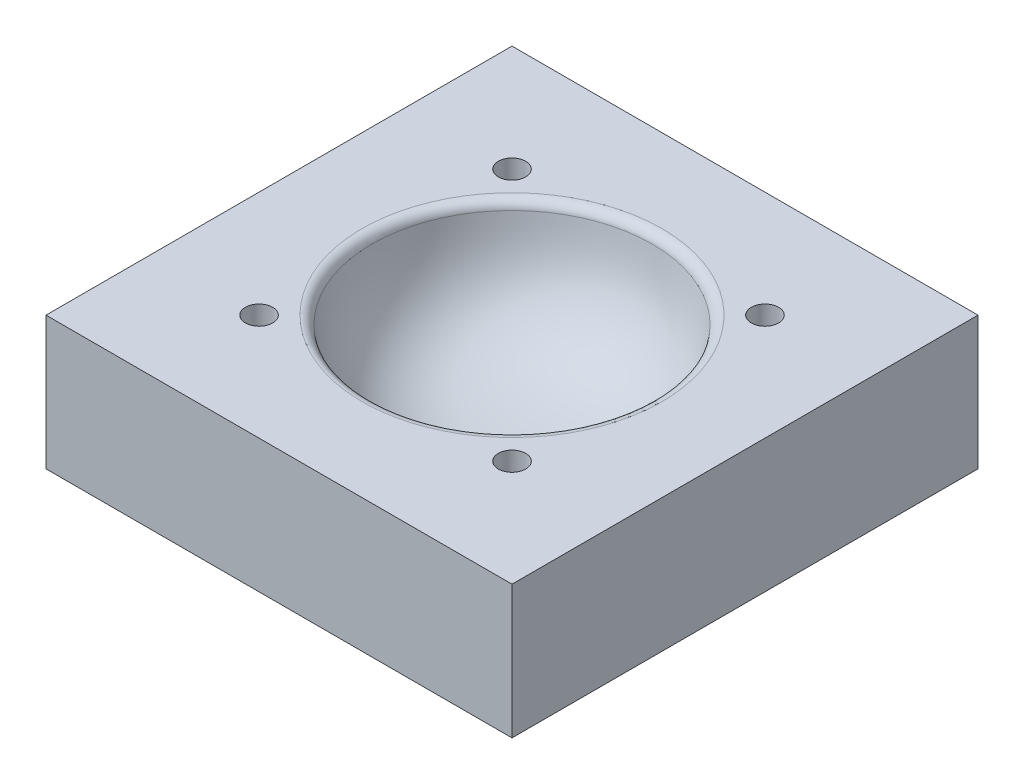
ISO-10303-21;
HEADER;
FILE_DESCRIPTION(('STEP AP214'),'2;1');
FILE_NAME('part.step','',(''),(''),'','','');
FILE_SCHEMA(('AUTOMOTIVE_DESIGN { 1 0 10303 214 1 1 1 1 }'));
ENDSEC;
DATA;
#1=APPLICATION_CONTEXT('core data for automotive mechanical design processes');
#2=APPLICATION_PROTOCOL_DEFINITION('international standard','automotive_design',2000,#1);
#3=PRODUCT_CONTEXT('',#1,'mechanical');
#4=PRODUCT('Part','Part','',(#3));
#5=PRODUCT_RELATED_PRODUCT_CATEGORY('part','',(#4));
#6=PRODUCT_DEFINITION_FORMATION('','',#4);
#7=PRODUCT_DEFINITION_CONTEXT('part definition',#1,'design');
#8=PRODUCT_DEFINITION('design','',#6,#7);
#9=PRODUCT_DEFINITION_SHAPE('','',#8);
#10=(LENGTH_UNIT() NAMED_UNIT(*) SI_UNIT(.MILLI.,.METRE.));
#11=(NAMED_UNIT(*) PLANE_ANGLE_UNIT() SI_UNIT($,.RADIAN.));
#12=(NAMED_UNIT(*) SI_UNIT($,.STERADIAN.) SOLID_ANGLE_UNIT());
#13=UNCERTAINTY_MEASURE_WITH_UNIT(LENGTH_MEASURE(1.E-05),#10,'distance_accuracy_value','');
#14=(GEOMETRIC_REPRESENTATION_CONTEXT(3) GLOBAL_UNCERTAINTY_ASSIGNED_CONTEXT((#13)) GLOBAL_UNIT_ASSIGNED_CONTEXT((#10,
#11,#12)) REPRESENTATION_CONTEXT('',''));
#15=CARTESIAN_POINT('',(0.,0.,0.));
#16=DIRECTION('',(0.,0.,1.));
#17=DIRECTION('',(1.,0.,0.));
#18=AXIS2_PLACEMENT_3D('',#15,#16,#17);
#19=CARTESIAN_POINT('',(35.,-20.,35.));
#20=DIRECTION('',(1.,0.,0.));
#21=DIRECTION('',(0.,0.,-1.));
#22=AXIS2_PLACEMENT_3D('',#19,#20,#21);
#23=PLANE('',#22);
#24=DIRECTION('',(0.,0.,-1.));
#25=VECTOR('',#24,1.);
#26=CARTESIAN_POINT('',(35.,0.,35.));
#27=LINE('',#26,#25);
#28=CARTESIAN_POINT('',(35.,0.,35.));
#29=VERTEX_POINT('',#28);
#30=CARTESIAN_POINT('',(35.,0.,-35.));
#31=VERTEX_POINT('',#30);
#32=EDGE_CURVE('E150',#29,#31,#27,.T.);
#33=ORIENTED_EDGE('',*,*,#32,.F.);
#34=DIRECTION('',(0.,1.,0.));
#35=VECTOR('',#34,1.);
#36=CARTESIAN_POINT('',(35.,-20.,35.));
#37=LINE('',#36,#35);
#38=CARTESIAN_POINT('',(35.,-20.,35.));
#39=VERTEX_POINT('',#38);
#40=EDGE_CURVE('E50',#39,#29,#37,.T.);
#41=ORIENTED_EDGE('',*,*,#40,.F.);
#42=DIRECTION('',(0.,0.,-1.));
#43=VECTOR('',#42,1.);
#44=CARTESIAN_POINT('',(35.,-20.,35.));
#45=LINE('',#44,#43);
#46=CARTESIAN_POINT('',(35.,-20.,-35.));
#47=VERTEX_POINT('',#46);
#48=EDGE_CURVE('E137',#39,#47,#45,.T.);
#49=ORIENTED_EDGE('',*,*,#48,.T.);
#50=DIRECTION('',(0.,1.,0.));
#51=VECTOR('',#50,1.);
#52=CARTESIAN_POINT('',(35.,-20.,-35.));
#53=LINE('',#52,#51);
#54=EDGE_CURVE('E79',#47,#31,#53,.T.);
#55=ORIENTED_EDGE('',*,*,#54,.T.);
#56=EDGE_LOOP('',(#33,#41,#49,#55));
#57=FACE_BOUND('',#56,.T.);
#58=ADVANCED_FACE('F33',(#57),#23,.T.);
#59=CARTESIAN_POINT('',(-35.,-20.,35.));
#60=DIRECTION('',(0.,0.,1.));
#61=DIRECTION('',(1.,0.,0.));
#62=AXIS2_PLACEMENT_3D('',#59,#60,#61);
#63=PLANE('',#62);
#64=DIRECTION('',(1.,0.,0.));
#65=VECTOR('',#64,1.);
#66=CARTESIAN_POINT('',(-35.,0.,35.));
#67=LINE('',#66,#65);
#68=CARTESIAN_POINT('',(-35.,0.,35.));
#69=VERTEX_POINT('',#68);
#70=EDGE_CURVE('E141',#69,#29,#67,.T.);
#71=ORIENTED_EDGE('',*,*,#70,.F.);
#72=DIRECTION('',(0.,1.,0.));
#73=VECTOR('',#72,1.);
#74=CARTESIAN_POINT('',(-35.,-20.,35.));
#75=LINE('',#74,#73);
#76=CARTESIAN_POINT('',(-35.,-20.,35.));
#77=VERTEX_POINT('',#76);
#78=EDGE_CURVE('E68',#77,#69,#75,.T.);
#79=ORIENTED_EDGE('',*,*,#78,.F.);
#80=DIRECTION('',(1.,0.,0.));
#81=VECTOR('',#80,1.);
#82=CARTESIAN_POINT('',(-35.,-20.,35.));
#83=LINE('',#82,#81);
#84=EDGE_CURVE('E139',#77,#39,#83,.T.);
#85=ORIENTED_EDGE('',*,*,#84,.T.);
#86=ORIENTED_EDGE('',*,*,#40,.T.);
#87=EDGE_LOOP('',(#71,#79,#85,#86));
#88=FACE_BOUND('',#87,.T.);
#89=ADVANCED_FACE('F104',(#88),#63,.T.);
#90=CARTESIAN_POINT('',(-35.,-20.,35.));
#91=DIRECTION('',(-1.,0.,0.));
#92=DIRECTION('',(0.,0.,1.));
#93=AXIS2_PLACEMENT_3D('',#90,#91,#92);
#94=PLANE('',#93);
#95=DIRECTION('',(0.,0.,1.));
#96=VECTOR('',#95,1.);
#97=CARTESIAN_POINT('',(-35.,0.,35.));
#98=LINE('',#97,#96);
#99=CARTESIAN_POINT('',(-35.,0.,-35.));
#100=VERTEX_POINT('',#99);
#101=EDGE_CURVE('E156',#100,#69,#98,.T.);
#102=ORIENTED_EDGE('',*,*,#101,.F.);
#103=DIRECTION('',(0.,1.,0.));
#104=VECTOR('',#103,1.);
#105=CARTESIAN_POINT('',(-35.,-20.,-35.));
#106=LINE('',#105,#104);
#107=CARTESIAN_POINT('',(-35.,-20.,-35.));
#108=VERTEX_POINT('',#107);
#109=EDGE_CURVE('E145',#108,#100,#106,.T.);
#110=ORIENTED_EDGE('',*,*,#109,.F.);
#111=DIRECTION('',(0.,0.,1.));
#112=VECTOR('',#111,1.);
#113=CARTESIAN_POINT('',(-35.,-20.,35.));
#114=LINE('',#113,#112);
#115=EDGE_CURVE('E143',#108,#77,#114,.T.);
#116=ORIENTED_EDGE('',*,*,#115,.T.);
#117=ORIENTED_EDGE('',*,*,#78,.T.);
#118=EDGE_LOOP('',(#102,#110,#116,#117));
#119=FACE_BOUND('',#118,.T.);
#120=ADVANCED_FACE('F108',(#119),#94,.T.);
#121=CARTESIAN_POINT('',(-35.,-20.,-35.));
#122=DIRECTION('',(0.,0.,-1.));
#123=DIRECTION('',(-1.,0.,0.));
#124=AXIS2_PLACEMENT_3D('',#121,#122,#123);
#125=PLANE('',#124);
#126=DIRECTION('',(-1.,0.,0.));
#127=VECTOR('',#126,1.);
#128=CARTESIAN_POINT('',(-35.,0.,-35.));
#129=LINE('',#128,#127);
#130=EDGE_CURVE('E153',#31,#100,#129,.T.);
#131=ORIENTED_EDGE('',*,*,#130,.F.);
#132=ORIENTED_EDGE('',*,*,#54,.F.);
#133=DIRECTION('',(-1.,0.,0.));
#134=VECTOR('',#133,1.);
#135=CARTESIAN_POINT('',(-35.,-20.,-35.));
#136=LINE('',#135,#134);
#137=EDGE_CURVE('E140',#47,#108,#136,.T.);
#138=ORIENTED_EDGE('',*,*,#137,.T.);
#139=ORIENTED_EDGE('',*,*,#109,.T.);
#140=EDGE_LOOP('',(#131,#132,#138,#139));
#141=FACE_BOUND('',#140,.T.);
#142=ADVANCED_FACE('F111',(#141),#125,.T.);
#143=CARTESIAN_POINT('',(0.,-20.,0.));
#144=DIRECTION('',(0.,-1.,0.));
#145=DIRECTION('',(0.,0.,-1.));
#146=AXIS2_PLACEMENT_3D('',#143,#144,#145);
#147=PLANE('',#146);
#148=CARTESIAN_POINT('',(19.,-20.,-19.));
#149=DIRECTION('',(0.,1.,0.));
#150=DIRECTION('',(0.,0.,1.));
#151=AXIS2_PLACEMENT_3D('',#148,#149,#150);
#152=CIRCLE('',#151,2.05000000000001);
#153=CARTESIAN_POINT('',(19.,-20.,-16.95));
#154=VERTEX_POINT('',#153);
#155=EDGE_CURVE('E123',#154,#154,#152,.T.);
#156=ORIENTED_EDGE('',*,*,#155,.T.);
#157=EDGE_LOOP('',(#156));
#158=FACE_BOUND('',#157,.T.);
#159=CARTESIAN_POINT('',(-19.,-20.,19.));
#160=DIRECTION('',(0.,1.,0.));
#161=DIRECTION('',(0.,0.,-1.));
#162=AXIS2_PLACEMENT_3D('',#159,#160,#161);
#163=CIRCLE('',#162,2.05);
#164=CARTESIAN_POINT('',(-19.,-20.,16.95));
#165=VERTEX_POINT('',#164);
#166=EDGE_CURVE('E127',#165,#165,#163,.T.);
#167=ORIENTED_EDGE('',*,*,#166,.T.);
#168=EDGE_LOOP('',(#167));
#169=FACE_BOUND('',#168,.T.);
#170=CARTESIAN_POINT('',(19.,-20.,19.));
#171=DIRECTION('',(0.,1.,0.));
#172=DIRECTION('',(0.,0.,-1.));
#173=AXIS2_PLACEMENT_3D('',#170,#171,#172);
#174=CIRCLE('',#173,2.05000000000001);
#175=CARTESIAN_POINT('',(19.,-20.,16.95));
#176=VERTEX_POINT('',#175);
#177=EDGE_CURVE('E131',#176,#176,#174,.T.);
#178=ORIENTED_EDGE('',*,*,#177,.T.);
#179=EDGE_LOOP('',(#178));
#180=FACE_BOUND('',#179,.T.);
#181=CARTESIAN_POINT('',(-19.,-20.,-19.));
#182=DIRECTION('',(0.,1.,0.));
#183=DIRECTION('',(0.,0.,1.));
#184=AXIS2_PLACEMENT_3D('',#181,#182,#183);
#185=CIRCLE('',#184,2.05);
#186=CARTESIAN_POINT('',(-19.,-20.,-16.95));
#187=VERTEX_POINT('',#186);
#188=EDGE_CURVE('E135',#187,#187,#185,.T.);
#189=ORIENTED_EDGE('',*,*,#188,.T.);
#190=EDGE_LOOP('',(#189));
#191=FACE_BOUND('',#190,.T.);
#192=ORIENTED_EDGE('',*,*,#48,.F.);
#193=ORIENTED_EDGE('',*,*,#84,.F.);
#194=ORIENTED_EDGE('',*,*,#115,.F.);
#195=ORIENTED_EDGE('',*,*,#137,.F.);
#196=EDGE_LOOP('',(#192,#193,#194,#195));
#197=FACE_BOUND('',#196,.T.);
#198=ADVANCED_FACE('F97',(#158,#169,#180,#191,#197),#147,.T.);
#199=CARTESIAN_POINT('',(0.,0.,0.));
#200=DIRECTION('',(0.,-1.,0.));
#201=DIRECTION('',(0.,0.,-1.));
#202=AXIS2_PLACEMENT_3D('',#199,#200,#201);
#203=PLANE('',#202);
#204=CARTESIAN_POINT('',(19.,0.,-19.));
#205=DIRECTION('',(0.,1.,0.));
#206=DIRECTION('',(0.,0.,1.));
#207=AXIS2_PLACEMENT_3D('',#204,#205,#206);
#208=CIRCLE('',#207,2.05000000000001);
#209=CARTESIAN_POINT('',(19.,0.,-16.95));
#210=VERTEX_POINT('',#209);
#211=EDGE_CURVE('E186',#210,#210,#208,.T.);
#212=ORIENTED_EDGE('',*,*,#211,.F.);
#213=EDGE_LOOP('',(#212));
#214=FACE_BOUND('',#213,.T.);
#215=CARTESIAN_POINT('',(-19.,0.,19.));
#216=DIRECTION('',(0.,1.,0.));
#217=DIRECTION('',(0.,0.,-1.));
#218=AXIS2_PLACEMENT_3D('',#215,#216,#217);
#219=CIRCLE('',#218,2.05);
#220=CARTESIAN_POINT('',(-19.,0.,16.95));
#221=VERTEX_POINT('',#220);
#222=EDGE_CURVE('E182',#221,#221,#219,.T.);
#223=ORIENTED_EDGE('',*,*,#222,.F.);
#224=EDGE_LOOP('',(#223));
#225=FACE_BOUND('',#224,.T.);
#226=CARTESIAN_POINT('',(19.,0.,19.));
#227=DIRECTION('',(0.,1.,0.));
#228=DIRECTION('',(0.,0.,-1.));
#229=AXIS2_PLACEMENT_3D('',#226,#227,#228);
#230=CIRCLE('',#229,2.05000000000001);
#231=CARTESIAN_POINT('',(19.,0.,16.95));
#232=VERTEX_POINT('',#231);
#233=EDGE_CURVE('E178',#232,#232,#230,.T.);
#234=ORIENTED_EDGE('',*,*,#233,.F.);
#235=EDGE_LOOP('',(#234));
#236=FACE_BOUND('',#235,.T.);
#237=CARTESIAN_POINT('',(-19.,0.,-19.));
#238=DIRECTION('',(0.,1.,0.));
#239=DIRECTION('',(0.,0.,1.));
#240=AXIS2_PLACEMENT_3D('',#237,#238,#239);
#241=CIRCLE('',#240,2.05);
#242=CARTESIAN_POINT('',(-19.,0.,-16.95));
#243=VERTEX_POINT('',#242);
#244=EDGE_CURVE('E171',#243,#243,#241,.T.);
#245=ORIENTED_EDGE('',*,*,#244,.F.);
#246=EDGE_LOOP('',(#245));
#247=FACE_BOUND('',#246,.T.);
#248=CARTESIAN_POINT('',(0.,0.,0.));
#249=DIRECTION('',(0.,-1.,0.));
#250=DIRECTION('',(0.,0.,-1.));
#251=AXIS2_PLACEMENT_3D('',#248,#249,#250);
#252=CIRCLE('',#251,22.5204226060683);
#253=CARTESIAN_POINT('',(0.,0.,-22.5204226060683));
#254=VERTEX_POINT('',#253);
#255=EDGE_CURVE('E42',#254,#254,#252,.T.);
#256=ORIENTED_EDGE('',*,*,#255,.T.);
#257=EDGE_LOOP('',(#256));
#258=FACE_BOUND('',#257,.T.);
#259=ORIENTED_EDGE('',*,*,#32,.T.);
#260=ORIENTED_EDGE('',*,*,#130,.T.);
#261=ORIENTED_EDGE('',*,*,#101,.T.);
#262=ORIENTED_EDGE('',*,*,#70,.T.);
#263=EDGE_LOOP('',(#259,#260,#261,#262));
#264=FACE_BOUND('',#263,.T.);
#265=ADVANCED_FACE('F87',(#214,#225,#236,#247,#258,#264),#203,.F.);
#266=CARTESIAN_POINT('',(0.,-17.2,0.));
#267=CARTESIAN_POINT('',(0.530678283162866,-17.2,0.));
#268=CARTESIAN_POINT('',(1.61157482003758,-17.1835087157177,0.));
#269=CARTESIAN_POINT('',(3.61553112490633,-17.0858866299731,0.));
#270=CARTESIAN_POINT('',(5.94412726876525,-16.8449193708704,0.));
#271=CARTESIAN_POINT('',(8.44843367017713,-16.3701312793384,0.));
#272=CARTESIAN_POINT('',(11.4426563992136,-15.4929340329107,0.));
#273=CARTESIAN_POINT('',(14.579654851125,-13.9372429801716,0.));
#274=CARTESIAN_POINT('',(17.3821644879229,-11.4027390106015,0.));
#275=CARTESIAN_POINT('',(19.1990092285278,-8.50089666406981,0.));
#276=CARTESIAN_POINT('',(20.2356905797532,-5.58319415725002,0.));
#277=CARTESIAN_POINT('',(20.706490618571,-3.31338756219236,0.));
#278=CARTESIAN_POINT('',(20.9818860785102,-1.63592916890464,0.));
#279=CARTESIAN_POINT('',(21.0968768410496,-0.894238761988542,0.));
#280=CARTESIAN_POINT('',(21.1588510841306,-0.511526957536839,0.));
#281=B_SPLINE_CURVE_WITH_KNOTS('',3,(#266,#267,#268,#269,#270,#271,#272,#273,#274,#275,#276,
#277,#278,#279,#280),.UNSPECIFIED.,.F.,.F.,(4,1,1,1,1,1,1,1,1,1,1,1,4),(0.,0.03125,0.0625,0.125,
0.1875,0.25,0.375,0.5,0.625,0.75,0.875,0.9375,1.),.UNSPECIFIED.);
#282=CARTESIAN_POINT('',(0.,-17.2,0.));
#283=DIRECTION('',(0.,-1.,0.));
#284=AXIS1_PLACEMENT('',#282,#283);
#285=SURFACE_OF_REVOLUTION('',#281,#284);
#286=CARTESIAN_POINT('',(0.,-1.26587766705882,0.));
#287=DIRECTION('',(0.,-1.,0.));
#288=DIRECTION('',(0.,0.,-1.));
#289=AXIS2_PLACEMENT_3D('',#286,#287,#288);
#290=CIRCLE('',#289,21.0388063489969);
#291=CARTESIAN_POINT('',(0.,-1.26587766705882,-21.0388063489969));
#292=VERTEX_POINT('',#291);
#293=EDGE_CURVE('E11',#292,#292,#290,.F.);
#294=ORIENTED_EDGE('',*,*,#293,.T.);
#295=EDGE_LOOP('',(#294));
#296=FACE_BOUND('',#295,.T.);
#297=CARTESIAN_POINT('',(0.,-17.2,0.));
#298=VERTEX_POINT('',#297);
#299=VERTEX_LOOP('',#298);
#300=FACE_BOUND('',#299,.T.);
#301=ADVANCED_FACE('F85',(#296,#300),#285,.T.);
#302=CARTESIAN_POINT('',(0.,-1.49999999999999,0.));
#303=DIRECTION('',(0.,-1.,0.));
#304=DIRECTION('',(0.,0.,-1.));
#305=AXIS2_PLACEMENT_3D('',#302,#303,#304);
#306=TOROIDAL_SURFACE('',#305,22.5204226060683,1.5);
#307=ORIENTED_EDGE('',*,*,#293,.F.);
#308=EDGE_LOOP('',(#307));
#309=FACE_BOUND('',#308,.T.);
#310=ORIENTED_EDGE('',*,*,#255,.F.);
#311=EDGE_LOOP('',(#310));
#312=FACE_BOUND('',#311,.T.);
#313=ADVANCED_FACE('F35',(#309,#312),#306,.T.);
#314=CARTESIAN_POINT('',(-19.,-20.,-19.));
#315=DIRECTION('',(0.,1.,0.));
#316=DIRECTION('',(0.,0.,1.));
#317=AXIS2_PLACEMENT_3D('',#314,#315,#316);
#318=CYLINDRICAL_SURFACE('',#317,2.05);
#319=ORIENTED_EDGE('',*,*,#188,.F.);
#320=EDGE_LOOP('',(#319));
#321=FACE_BOUND('',#320,.T.);
#322=ORIENTED_EDGE('',*,*,#244,.T.);
#323=EDGE_LOOP('',(#322));
#324=FACE_BOUND('',#323,.T.);
#325=ADVANCED_FACE('F94',(#321,#324),#318,.F.);
#326=CARTESIAN_POINT('',(19.,-20.,19.));
#327=DIRECTION('',(0.,1.,0.));
#328=DIRECTION('',(0.,0.,1.));
#329=AXIS2_PLACEMENT_3D('',#326,#327,#328);
#330=CYLINDRICAL_SURFACE('',#329,2.05000000000001);
#331=ORIENTED_EDGE('',*,*,#177,.F.);
#332=EDGE_LOOP('',(#331));
#333=FACE_BOUND('',#332,.T.);
#334=ORIENTED_EDGE('',*,*,#233,.T.);
#335=EDGE_LOOP('',(#334));
#336=FACE_BOUND('',#335,.T.);
#337=ADVANCED_FACE('F200',(#333,#336),#330,.F.);
#338=CARTESIAN_POINT('',(-19.,-20.,19.));
#339=DIRECTION('',(0.,1.,0.));
#340=DIRECTION('',(0.,0.,1.));
#341=AXIS2_PLACEMENT_3D('',#338,#339,#340);
#342=CYLINDRICAL_SURFACE('',#341,2.05);
#343=ORIENTED_EDGE('',*,*,#166,.F.);
#344=EDGE_LOOP('',(#343));
#345=FACE_BOUND('',#344,.T.);
#346=ORIENTED_EDGE('',*,*,#222,.T.);
#347=EDGE_LOOP('',(#346));
#348=FACE_BOUND('',#347,.T.);
#349=ADVANCED_FACE('F205',(#345,#348),#342,.F.);
#350=CARTESIAN_POINT('',(19.,-20.,-19.));
#351=DIRECTION('',(0.,1.,0.));
#352=DIRECTION('',(0.,0.,1.));
#353=AXIS2_PLACEMENT_3D('',#350,#351,#352);
#354=CYLINDRICAL_SURFACE('',#353,2.05000000000001);
#355=ORIENTED_EDGE('',*,*,#155,.F.);
#356=EDGE_LOOP('',(#355));
#357=FACE_BOUND('',#356,.T.);
#358=ORIENTED_EDGE('',*,*,#211,.T.);
#359=EDGE_LOOP('',(#358));
#360=FACE_BOUND('',#359,.T.);
#361=ADVANCED_FACE('F191',(#357,#360),#354,.F.);
#362=CLOSED_SHELL('',(#58,#89,#120,#142,#198,#265,#301,#313,#325,#337,#349,#361));
#363=MANIFOLD_SOLID_BREP('B2',#362);
#364=ADVANCED_BREP_SHAPE_REPRESENTATION('',(#18,#363),#14);
#365=SHAPE_DEFINITION_REPRESENTATION(#9,#364);
ENDSEC;
END-ISO-10303-21;
